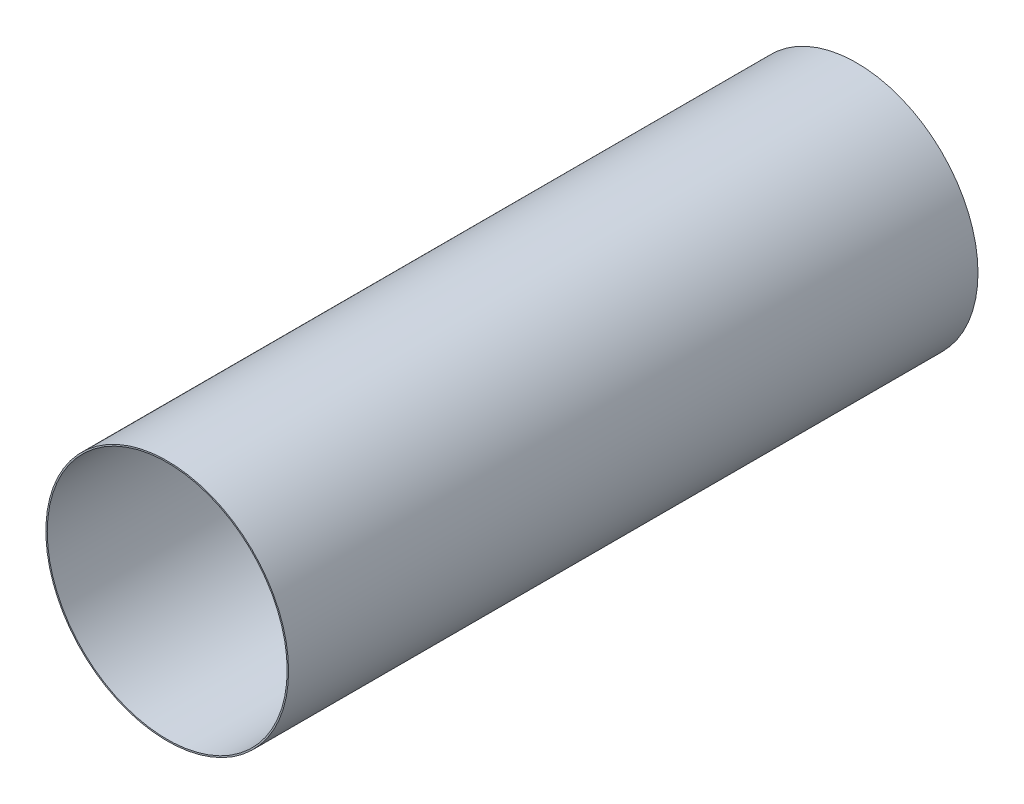
ISO-10303-21;
HEADER;
FILE_DESCRIPTION(('STEP AP214'),'2;1');
FILE_NAME('part.step','',(''),(''),'','','');
FILE_SCHEMA(('AUTOMOTIVE_DESIGN { 1 0 10303 214 1 1 1 1 }'));
ENDSEC;
DATA;
#1=APPLICATION_CONTEXT('core data for automotive mechanical design processes');
#2=APPLICATION_PROTOCOL_DEFINITION('international standard','automotive_design',2000,#1);
#3=PRODUCT_CONTEXT('',#1,'mechanical');
#4=PRODUCT('Part','Part','',(#3));
#5=PRODUCT_RELATED_PRODUCT_CATEGORY('part','',(#4));
#6=PRODUCT_DEFINITION_FORMATION('','',#4);
#7=PRODUCT_DEFINITION_CONTEXT('part definition',#1,'design');
#8=PRODUCT_DEFINITION('design','',#6,#7);
#9=PRODUCT_DEFINITION_SHAPE('','',#8);
#10=(LENGTH_UNIT() NAMED_UNIT(*) SI_UNIT(.MILLI.,.METRE.));
#11=(NAMED_UNIT(*) PLANE_ANGLE_UNIT() SI_UNIT($,.RADIAN.));
#12=(NAMED_UNIT(*) SI_UNIT($,.STERADIAN.) SOLID_ANGLE_UNIT());
#13=UNCERTAINTY_MEASURE_WITH_UNIT(LENGTH_MEASURE(1.E-05),#10,'distance_accuracy_value','');
#14=(GEOMETRIC_REPRESENTATION_CONTEXT(3) GLOBAL_UNCERTAINTY_ASSIGNED_CONTEXT((#13)) GLOBAL_UNIT_ASSIGNED_CONTEXT((#10,
#11,#12)) REPRESENTATION_CONTEXT('',''));
#15=CARTESIAN_POINT('',(0.,0.,0.));
#16=DIRECTION('',(0.,0.,1.));
#17=DIRECTION('',(1.,0.,0.));
#18=AXIS2_PLACEMENT_3D('',#15,#16,#17);
#19=CARTESIAN_POINT('',(0.,0.,-12100.));
#20=DIRECTION('',(0.,0.,1.));
#21=DIRECTION('',(1.,0.,0.));
#22=AXIS2_PLACEMENT_3D('',#19,#20,#21);
#23=CYLINDRICAL_SURFACE('',#22,2130.0235);
#24=CARTESIAN_POINT('',(0.,0.,-12100.));
#25=DIRECTION('',(0.,0.,1.));
#26=DIRECTION('',(1.,0.,0.));
#27=AXIS2_PLACEMENT_3D('',#24,#25,#26);
#28=CIRCLE('',#27,2130.0235);
#29=CARTESIAN_POINT('',(2130.0235,0.,-12100.));
#30=VERTEX_POINT('',#29);
#31=EDGE_CURVE('E10',#30,#30,#28,.T.);
#32=ORIENTED_EDGE('',*,*,#31,.T.);
#33=EDGE_LOOP('',(#32));
#34=FACE_BOUND('',#33,.T.);
#35=CARTESIAN_POINT('',(0.,0.,0.));
#36=DIRECTION('',(0.,0.,1.));
#37=DIRECTION('',(1.,0.,0.));
#38=AXIS2_PLACEMENT_3D('',#35,#36,#37);
#39=CIRCLE('',#38,2130.0235);
#40=CARTESIAN_POINT('',(2130.0235,0.,0.));
#41=VERTEX_POINT('',#40);
#42=EDGE_CURVE('E32',#41,#41,#39,.T.);
#43=ORIENTED_EDGE('',*,*,#42,.F.);
#44=EDGE_LOOP('',(#43));
#45=FACE_BOUND('',#44,.T.);
#46=ADVANCED_FACE('F29',(#34,#45),#23,.T.);
#47=CARTESIAN_POINT('',(0.,0.,-12100.));
#48=DIRECTION('',(0.,0.,1.));
#49=DIRECTION('',(1.,0.,0.));
#50=AXIS2_PLACEMENT_3D('',#47,#48,#49);
#51=PLANE('',#50);
#52=CARTESIAN_POINT('',(0.,0.,-12100.));
#53=DIRECTION('',(0.,0.,1.));
#54=DIRECTION('',(1.,0.,0.));
#55=AXIS2_PLACEMENT_3D('',#52,#53,#54);
#56=CIRCLE('',#55,2105.5785);
#57=CARTESIAN_POINT('',(2105.5785,0.,-12100.));
#58=VERTEX_POINT('',#57);
#59=EDGE_CURVE('E39',#58,#58,#56,.T.);
#60=ORIENTED_EDGE('',*,*,#59,.T.);
#61=EDGE_LOOP('',(#60));
#62=FACE_BOUND('',#61,.T.);
#63=ORIENTED_EDGE('',*,*,#31,.F.);
#64=EDGE_LOOP('',(#63));
#65=FACE_BOUND('',#64,.T.);
#66=ADVANCED_FACE('F47',(#62,#65),#51,.F.);
#67=CARTESIAN_POINT('',(0.,0.,0.));
#68=DIRECTION('',(0.,0.,1.));
#69=DIRECTION('',(1.,0.,0.));
#70=AXIS2_PLACEMENT_3D('',#67,#68,#69);
#71=PLANE('',#70);
#72=CARTESIAN_POINT('',(0.,0.,0.));
#73=DIRECTION('',(0.,0.,1.));
#74=DIRECTION('',(1.,0.,0.));
#75=AXIS2_PLACEMENT_3D('',#72,#73,#74);
#76=CIRCLE('',#75,2105.5785);
#77=CARTESIAN_POINT('',(2105.5785,0.,0.));
#78=VERTEX_POINT('',#77);
#79=EDGE_CURVE('E41',#78,#78,#76,.T.);
#80=ORIENTED_EDGE('',*,*,#79,.F.);
#81=EDGE_LOOP('',(#80));
#82=FACE_BOUND('',#81,.T.);
#83=ORIENTED_EDGE('',*,*,#42,.T.);
#84=EDGE_LOOP('',(#83));
#85=FACE_BOUND('',#84,.T.);
#86=ADVANCED_FACE('F53',(#82,#85),#71,.T.);
#87=CARTESIAN_POINT('',(0.,0.,-12100.));
#88=DIRECTION('',(0.,0.,1.));
#89=DIRECTION('',(1.,0.,0.));
#90=AXIS2_PLACEMENT_3D('',#87,#88,#89);
#91=CYLINDRICAL_SURFACE('',#90,2105.5785);
#92=ORIENTED_EDGE('',*,*,#59,.F.);
#93=EDGE_LOOP('',(#92));
#94=FACE_BOUND('',#93,.T.);
#95=ORIENTED_EDGE('',*,*,#79,.T.);
#96=EDGE_LOOP('',(#95));
#97=FACE_BOUND('',#96,.T.);
#98=ADVANCED_FACE('F50',(#94,#97),#91,.F.);
#99=CLOSED_SHELL('',(#46,#66,#86,#98));
#100=MANIFOLD_SOLID_BREP('B2',#99);
#101=ADVANCED_BREP_SHAPE_REPRESENTATION('',(#18,#100),#14);
#102=SHAPE_DEFINITION_REPRESENTATION(#9,#101);
ENDSEC;
END-ISO-10303-21;
